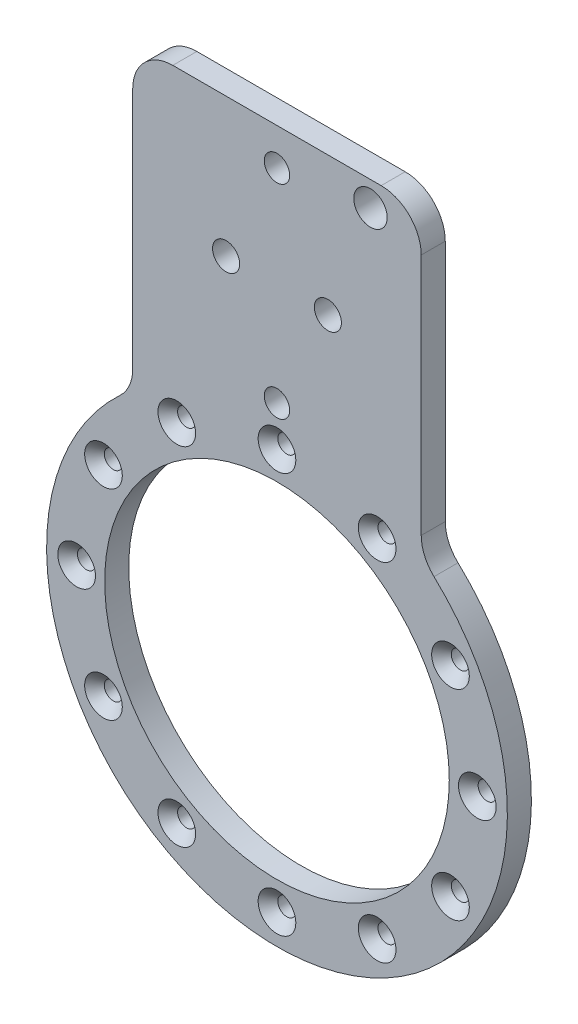
ISO-10303-21;
HEADER;
FILE_DESCRIPTION(('STEP AP214'),'2;1');
FILE_NAME('part.step','',(''),(''),'','','');
FILE_SCHEMA(('AUTOMOTIVE_DESIGN { 1 0 10303 214 1 1 1 1 }'));
ENDSEC;
DATA;
#1=APPLICATION_CONTEXT('core data for automotive mechanical design processes');
#2=APPLICATION_PROTOCOL_DEFINITION('international standard','automotive_design',2000,#1);
#3=PRODUCT_CONTEXT('',#1,'mechanical');
#4=PRODUCT('Part','Part','',(#3));
#5=PRODUCT_RELATED_PRODUCT_CATEGORY('part','',(#4));
#6=PRODUCT_DEFINITION_FORMATION('','',#4);
#7=PRODUCT_DEFINITION_CONTEXT('part definition',#1,'design');
#8=PRODUCT_DEFINITION('design','',#6,#7);
#9=PRODUCT_DEFINITION_SHAPE('','',#8);
#10=(LENGTH_UNIT() NAMED_UNIT(*) SI_UNIT(.MILLI.,.METRE.));
#11=(NAMED_UNIT(*) PLANE_ANGLE_UNIT() SI_UNIT($,.RADIAN.));
#12=(NAMED_UNIT(*) SI_UNIT($,.STERADIAN.) SOLID_ANGLE_UNIT());
#13=UNCERTAINTY_MEASURE_WITH_UNIT(LENGTH_MEASURE(1.E-05),#10,'distance_accuracy_value','');
#14=(GEOMETRIC_REPRESENTATION_CONTEXT(3) GLOBAL_UNCERTAINTY_ASSIGNED_CONTEXT((#13)) GLOBAL_UNIT_ASSIGNED_CONTEXT((#10,
#11,#12)) REPRESENTATION_CONTEXT('',''));
#15=CARTESIAN_POINT('',(0.,0.,0.));
#16=DIRECTION('',(0.,0.,1.));
#17=DIRECTION('',(1.,0.,0.));
#18=AXIS2_PLACEMENT_3D('',#15,#16,#17);
#19=CARTESIAN_POINT('',(0.,0.,3.));
#20=DIRECTION('',(0.,0.,1.));
#21=DIRECTION('',(1.,0.,0.));
#22=AXIS2_PLACEMENT_3D('',#19,#20,#21);
#23=PLANE('',#22);
#24=CARTESIAN_POINT('',(23.335,113.835,3.));
#25=DIRECTION('',(0.,0.,-1.));
#26=DIRECTION('',(-1.,0.,0.));
#27=AXIS2_PLACEMENT_3D('',#24,#25,#26);
#28=CIRCLE('',#27,4.165);
#29=CARTESIAN_POINT('',(19.17,113.835,3.));
#30=VERTEX_POINT('',#29);
#31=EDGE_CURVE('E604',#30,#30,#28,.T.);
#32=ORIENTED_EDGE('',*,*,#31,.T.);
#33=EDGE_LOOP('',(#32));
#34=FACE_BOUND('',#33,.T.);
#35=CARTESIAN_POINT('',(0.,50.,3.));
#36=DIRECTION('',(0.,0.,1.));
#37=DIRECTION('',(1.,0.,0.));
#38=AXIS2_PLACEMENT_3D('',#35,#36,#37);
#39=CIRCLE('',#38,4.7);
#40=CARTESIAN_POINT('',(4.7,50.,3.));
#41=VERTEX_POINT('',#40);
#42=EDGE_CURVE('E601',#41,#41,#39,.T.);
#43=ORIENTED_EDGE('',*,*,#42,.F.);
#44=EDGE_LOOP('',(#43));
#45=FACE_BOUND('',#44,.T.);
#46=CARTESIAN_POINT('',(25.,43.3012701892219,3.));
#47=DIRECTION('',(0.,0.,1.));
#48=DIRECTION('',(1.,0.,0.));
#49=AXIS2_PLACEMENT_3D('',#46,#47,#48);
#50=CIRCLE('',#49,4.7);
#51=CARTESIAN_POINT('',(29.7,43.3012701892219,3.));
#52=VERTEX_POINT('',#51);
#53=EDGE_CURVE('E595',#52,#52,#50,.T.);
#54=ORIENTED_EDGE('',*,*,#53,.F.);
#55=EDGE_LOOP('',(#54));
#56=FACE_BOUND('',#55,.T.);
#57=CARTESIAN_POINT('',(43.3012701892219,25.,3.));
#58=DIRECTION('',(0.,0.,1.));
#59=DIRECTION('',(1.,0.,0.));
#60=AXIS2_PLACEMENT_3D('',#57,#58,#59);
#61=CIRCLE('',#60,4.7);
#62=CARTESIAN_POINT('',(48.0012701892219,25.,3.));
#63=VERTEX_POINT('',#62);
#64=EDGE_CURVE('E589',#63,#63,#61,.T.);
#65=ORIENTED_EDGE('',*,*,#64,.F.);
#66=EDGE_LOOP('',(#65));
#67=FACE_BOUND('',#66,.T.);
#68=CARTESIAN_POINT('',(50.,0.,3.));
#69=DIRECTION('',(0.,0.,1.));
#70=DIRECTION('',(1.,0.,0.));
#71=AXIS2_PLACEMENT_3D('',#68,#69,#70);
#72=CIRCLE('',#71,4.7);
#73=CARTESIAN_POINT('',(54.7,0.,3.));
#74=VERTEX_POINT('',#73);
#75=EDGE_CURVE('E583',#74,#74,#72,.T.);
#76=ORIENTED_EDGE('',*,*,#75,.F.);
#77=EDGE_LOOP('',(#76));
#78=FACE_BOUND('',#77,.T.);
#79=CARTESIAN_POINT('',(43.3012701892219,-25.,3.));
#80=DIRECTION('',(0.,0.,1.));
#81=DIRECTION('',(1.,0.,0.));
#82=AXIS2_PLACEMENT_3D('',#79,#80,#81);
#83=CIRCLE('',#82,4.7);
#84=CARTESIAN_POINT('',(48.0012701892219,-25.,3.));
#85=VERTEX_POINT('',#84);
#86=EDGE_CURVE('E577',#85,#85,#83,.T.);
#87=ORIENTED_EDGE('',*,*,#86,.F.);
#88=EDGE_LOOP('',(#87));
#89=FACE_BOUND('',#88,.T.);
#90=CARTESIAN_POINT('',(25.,-43.3012701892219,3.));
#91=DIRECTION('',(0.,0.,1.));
#92=DIRECTION('',(1.,0.,0.));
#93=AXIS2_PLACEMENT_3D('',#90,#91,#92);
#94=CIRCLE('',#93,4.7);
#95=CARTESIAN_POINT('',(29.7,-43.3012701892219,3.));
#96=VERTEX_POINT('',#95);
#97=EDGE_CURVE('E571',#96,#96,#94,.T.);
#98=ORIENTED_EDGE('',*,*,#97,.F.);
#99=EDGE_LOOP('',(#98));
#100=FACE_BOUND('',#99,.T.);
#101=CARTESIAN_POINT('',(0.,-50.,3.));
#102=DIRECTION('',(0.,0.,1.));
#103=DIRECTION('',(1.,0.,0.));
#104=AXIS2_PLACEMENT_3D('',#101,#102,#103);
#105=CIRCLE('',#104,4.7);
#106=CARTESIAN_POINT('',(4.7,-50.,3.));
#107=VERTEX_POINT('',#106);
#108=EDGE_CURVE('E565',#107,#107,#105,.T.);
#109=ORIENTED_EDGE('',*,*,#108,.F.);
#110=EDGE_LOOP('',(#109));
#111=FACE_BOUND('',#110,.T.);
#112=CARTESIAN_POINT('',(-25.,-43.3012701892219,3.));
#113=DIRECTION('',(0.,0.,1.));
#114=DIRECTION('',(1.,0.,0.));
#115=AXIS2_PLACEMENT_3D('',#112,#113,#114);
#116=CIRCLE('',#115,4.7);
#117=CARTESIAN_POINT('',(-20.3,-43.3012701892219,3.));
#118=VERTEX_POINT('',#117);
#119=EDGE_CURVE('E559',#118,#118,#116,.T.);
#120=ORIENTED_EDGE('',*,*,#119,.F.);
#121=EDGE_LOOP('',(#120));
#122=FACE_BOUND('',#121,.T.);
#123=CARTESIAN_POINT('',(-43.3012701892219,-25.,3.));
#124=DIRECTION('',(0.,0.,1.));
#125=DIRECTION('',(1.,0.,0.));
#126=AXIS2_PLACEMENT_3D('',#123,#124,#125);
#127=CIRCLE('',#126,4.7);
#128=CARTESIAN_POINT('',(-38.6012701892219,-25.,3.));
#129=VERTEX_POINT('',#128);
#130=EDGE_CURVE('E553',#129,#129,#127,.T.);
#131=ORIENTED_EDGE('',*,*,#130,.F.);
#132=EDGE_LOOP('',(#131));
#133=FACE_BOUND('',#132,.T.);
#134=CARTESIAN_POINT('',(-50.,0.,3.));
#135=DIRECTION('',(0.,0.,1.));
#136=DIRECTION('',(1.,0.,0.));
#137=AXIS2_PLACEMENT_3D('',#134,#135,#136);
#138=CIRCLE('',#137,4.7);
#139=CARTESIAN_POINT('',(-45.3,0.,3.));
#140=VERTEX_POINT('',#139);
#141=EDGE_CURVE('E547',#140,#140,#138,.T.);
#142=ORIENTED_EDGE('',*,*,#141,.F.);
#143=EDGE_LOOP('',(#142));
#144=FACE_BOUND('',#143,.T.);
#145=CARTESIAN_POINT('',(-43.301270189222,25.,3.));
#146=DIRECTION('',(0.,0.,1.));
#147=DIRECTION('',(1.,0.,0.));
#148=AXIS2_PLACEMENT_3D('',#145,#146,#147);
#149=CIRCLE('',#148,4.7);
#150=CARTESIAN_POINT('',(-38.6012701892219,25.,3.));
#151=VERTEX_POINT('',#150);
#152=EDGE_CURVE('E541',#151,#151,#149,.T.);
#153=ORIENTED_EDGE('',*,*,#152,.F.);
#154=EDGE_LOOP('',(#153));
#155=FACE_BOUND('',#154,.T.);
#156=CARTESIAN_POINT('',(-25.,43.3012701892219,3.));
#157=DIRECTION('',(0.,0.,1.));
#158=DIRECTION('',(1.,0.,0.));
#159=AXIS2_PLACEMENT_3D('',#156,#157,#158);
#160=CIRCLE('',#159,4.7);
#161=CARTESIAN_POINT('',(-20.3,43.3012701892219,3.));
#162=VERTEX_POINT('',#161);
#163=EDGE_CURVE('E535',#162,#162,#160,.T.);
#164=ORIENTED_EDGE('',*,*,#163,.F.);
#165=EDGE_LOOP('',(#164));
#166=FACE_BOUND('',#165,.T.);
#167=CARTESIAN_POINT('',(-12.7,85.4,3.));
#168=DIRECTION('',(0.,0.,1.));
#169=DIRECTION('',(1.,0.,0.));
#170=AXIS2_PLACEMENT_3D('',#167,#168,#169);
#171=CIRCLE('',#170,3.3782);
#172=CARTESIAN_POINT('',(-9.3218,85.4,3.));
#173=VERTEX_POINT('',#172);
#174=EDGE_CURVE('E531',#173,#173,#171,.T.);
#175=ORIENTED_EDGE('',*,*,#174,.F.);
#176=EDGE_LOOP('',(#175));
#177=FACE_BOUND('',#176,.T.);
#178=CARTESIAN_POINT('',(12.7,85.4,3.));
#179=DIRECTION('',(0.,0.,1.));
#180=DIRECTION('',(1.,0.,0.));
#181=AXIS2_PLACEMENT_3D('',#178,#179,#180);
#182=CIRCLE('',#181,3.3782);
#183=CARTESIAN_POINT('',(16.0782,85.4,3.));
#184=VERTEX_POINT('',#183);
#185=EDGE_CURVE('E525',#184,#184,#182,.T.);
#186=ORIENTED_EDGE('',*,*,#185,.F.);
#187=EDGE_LOOP('',(#186));
#188=FACE_BOUND('',#187,.T.);
#189=CARTESIAN_POINT('',(0.,60.,3.));
#190=DIRECTION('',(0.,0.,1.));
#191=DIRECTION('',(1.,0.,0.));
#192=AXIS2_PLACEMENT_3D('',#189,#190,#191);
#193=CIRCLE('',#192,3.175);
#194=CARTESIAN_POINT('',(3.175,60.,3.));
#195=VERTEX_POINT('',#194);
#196=EDGE_CURVE('E519',#195,#195,#193,.T.);
#197=ORIENTED_EDGE('',*,*,#196,.F.);
#198=EDGE_LOOP('',(#197));
#199=FACE_BOUND('',#198,.T.);
#200=CARTESIAN_POINT('',(0.,110.8,3.));
#201=DIRECTION('',(0.,0.,1.));
#202=DIRECTION('',(1.,0.,0.));
#203=AXIS2_PLACEMENT_3D('',#200,#201,#202);
#204=CIRCLE('',#203,3.175);
#205=CARTESIAN_POINT('',(3.175,110.8,3.));
#206=VERTEX_POINT('',#205);
#207=EDGE_CURVE('E513',#206,#206,#204,.T.);
#208=ORIENTED_EDGE('',*,*,#207,.F.);
#209=EDGE_LOOP('',(#208));
#210=FACE_BOUND('',#209,.T.);
#211=DIRECTION('',(0.,1.,0.));
#212=VECTOR('',#211,1.);
#213=CARTESIAN_POINT('',(36.,120.,3.));
#214=LINE('',#213,#212);
#215=CARTESIAN_POINT('',(36.,49.3988866271295,3.));
#216=VERTEX_POINT('',#215);
#217=CARTESIAN_POINT('',(36.,110.,3.));
#218=VERTEX_POINT('',#217);
#219=EDGE_CURVE('E175',#216,#218,#214,.T.);
#220=ORIENTED_EDGE('',*,*,#219,.T.);
#221=CARTESIAN_POINT('',(26.,110.,3.));
#222=DIRECTION('',(0.,0.,1.));
#223=DIRECTION('',(1.,0.,0.));
#224=AXIS2_PLACEMENT_3D('',#221,#222,#223);
#225=CIRCLE('',#224,10.);
#226=CARTESIAN_POINT('',(26.,120.,3.));
#227=VERTEX_POINT('',#226);
#228=EDGE_CURVE('E146',#218,#227,#225,.T.);
#229=ORIENTED_EDGE('',*,*,#228,.T.);
#230=DIRECTION('',(-1.,0.,0.));
#231=VECTOR('',#230,1.);
#232=CARTESIAN_POINT('',(-36.,120.,3.));
#233=LINE('',#232,#231);
#234=CARTESIAN_POINT('',(-26.,120.,3.));
#235=VERTEX_POINT('',#234);
#236=EDGE_CURVE('E124',#227,#235,#233,.T.);
#237=ORIENTED_EDGE('',*,*,#236,.T.);
#238=CARTESIAN_POINT('',(-26.,110.,3.));
#239=DIRECTION('',(0.,0.,1.));
#240=DIRECTION('',(1.,0.,0.));
#241=AXIS2_PLACEMENT_3D('',#238,#239,#240);
#242=CIRCLE('',#241,10.);
#243=CARTESIAN_POINT('',(-36.,110.,3.));
#244=VERTEX_POINT('',#243);
#245=EDGE_CURVE('E61',#235,#244,#242,.T.);
#246=ORIENTED_EDGE('',*,*,#245,.T.);
#247=DIRECTION('',(0.,-1.,0.));
#248=VECTOR('',#247,1.);
#249=CARTESIAN_POINT('',(-36.,44.8358115795845,3.));
#250=LINE('',#249,#248);
#251=CARTESIAN_POINT('',(-36.,49.3988866271295,3.));
#252=VERTEX_POINT('',#251);
#253=EDGE_CURVE('E139',#244,#252,#250,.T.);
#254=ORIENTED_EDGE('',*,*,#253,.T.);
#255=CARTESIAN_POINT('',(-46.,49.3988866271295,3.));
#256=DIRECTION('',(0.,0.,1.));
#257=DIRECTION('',(1.,0.,0.));
#258=AXIS2_PLACEMENT_3D('',#255,#256,#257);
#259=CIRCLE('',#258,10.);
#260=CARTESIAN_POINT('',(-39.1851851851852,42.08053305274,3.));
#261=VERTEX_POINT('',#260);
#262=EDGE_CURVE('E159',#252,#261,#259,.F.);
#263=ORIENTED_EDGE('',*,*,#262,.T.);
#264=CARTESIAN_POINT('',(0.,0.,3.));
#265=DIRECTION('',(0.,0.,1.));
#266=DIRECTION('',(1.,0.,0.));
#267=AXIS2_PLACEMENT_3D('',#264,#265,#266);
#268=CIRCLE('',#267,57.5);
#269=CARTESIAN_POINT('',(39.1851851851852,42.08053305274,3.));
#270=VERTEX_POINT('',#269);
#271=EDGE_CURVE('E133',#261,#270,#268,.T.);
#272=ORIENTED_EDGE('',*,*,#271,.T.);
#273=CARTESIAN_POINT('',(46.,49.3988866271295,3.));
#274=DIRECTION('',(0.,0.,1.));
#275=DIRECTION('',(1.,0.,0.));
#276=AXIS2_PLACEMENT_3D('',#273,#274,#275);
#277=CIRCLE('',#276,10.);
#278=EDGE_CURVE('E11',#270,#216,#277,.F.);
#279=ORIENTED_EDGE('',*,*,#278,.T.);
#280=EDGE_LOOP('',(#220,#229,#237,#246,#254,#263,#272,#279));
#281=FACE_BOUND('',#280,.T.);
#282=CARTESIAN_POINT('',(0.,0.,3.));
#283=DIRECTION('',(0.,0.,1.));
#284=DIRECTION('',(1.,0.,0.));
#285=AXIS2_PLACEMENT_3D('',#282,#283,#284);
#286=CIRCLE('',#285,43.);
#287=CARTESIAN_POINT('',(43.,0.,3.));
#288=VERTEX_POINT('',#287);
#289=EDGE_CURVE('E170',#288,#288,#286,.T.);
#290=ORIENTED_EDGE('',*,*,#289,.F.);
#291=EDGE_LOOP('',(#290));
#292=FACE_BOUND('',#291,.T.);
#293=ADVANCED_FACE('F39',(#34,#45,#56,#67,#78,#89,#100,#111,#122,#133,#144,#155,#166,#177,#188,
#199,#210,#281,#292),#23,.T.);
#294=CARTESIAN_POINT('',(0.,0.,-3.));
#295=DIRECTION('',(0.,0.,1.));
#296=DIRECTION('',(1.,0.,0.));
#297=AXIS2_PLACEMENT_3D('',#294,#295,#296);
#298=PLANE('',#297);
#299=CARTESIAN_POINT('',(23.335,113.835,-3.));
#300=DIRECTION('',(0.,0.,-1.));
#301=DIRECTION('',(-1.,0.,0.));
#302=AXIS2_PLACEMENT_3D('',#299,#300,#301);
#303=CIRCLE('',#302,4.165);
#304=CARTESIAN_POINT('',(19.17,113.835,-3.));
#305=VERTEX_POINT('',#304);
#306=EDGE_CURVE('E605',#305,#305,#303,.T.);
#307=ORIENTED_EDGE('',*,*,#306,.F.);
#308=EDGE_LOOP('',(#307));
#309=FACE_BOUND('',#308,.T.);
#310=CARTESIAN_POINT('',(-12.7,85.4,-3.));
#311=DIRECTION('',(0.,0.,1.));
#312=DIRECTION('',(1.,0.,0.));
#313=AXIS2_PLACEMENT_3D('',#310,#311,#312);
#314=CIRCLE('',#313,3.3782);
#315=CARTESIAN_POINT('',(-9.3218,85.4,-3.));
#316=VERTEX_POINT('',#315);
#317=EDGE_CURVE('E528',#316,#316,#314,.T.);
#318=ORIENTED_EDGE('',*,*,#317,.T.);
#319=EDGE_LOOP('',(#318));
#320=FACE_BOUND('',#319,.T.);
#321=CARTESIAN_POINT('',(12.7,85.4,-3.));
#322=DIRECTION('',(0.,0.,1.));
#323=DIRECTION('',(1.,0.,0.));
#324=AXIS2_PLACEMENT_3D('',#321,#322,#323);
#325=CIRCLE('',#324,3.3782);
#326=CARTESIAN_POINT('',(16.0782,85.4,-3.));
#327=VERTEX_POINT('',#326);
#328=EDGE_CURVE('E522',#327,#327,#325,.T.);
#329=ORIENTED_EDGE('',*,*,#328,.T.);
#330=EDGE_LOOP('',(#329));
#331=FACE_BOUND('',#330,.T.);
#332=CARTESIAN_POINT('',(0.,60.,-3.));
#333=DIRECTION('',(0.,0.,1.));
#334=DIRECTION('',(1.,0.,0.));
#335=AXIS2_PLACEMENT_3D('',#332,#333,#334);
#336=CIRCLE('',#335,3.175);
#337=CARTESIAN_POINT('',(3.175,60.,-3.));
#338=VERTEX_POINT('',#337);
#339=EDGE_CURVE('E516',#338,#338,#336,.T.);
#340=ORIENTED_EDGE('',*,*,#339,.T.);
#341=EDGE_LOOP('',(#340));
#342=FACE_BOUND('',#341,.T.);
#343=CARTESIAN_POINT('',(0.,110.8,-3.));
#344=DIRECTION('',(0.,0.,1.));
#345=DIRECTION('',(1.,0.,0.));
#346=AXIS2_PLACEMENT_3D('',#343,#344,#345);
#347=CIRCLE('',#346,3.175);
#348=CARTESIAN_POINT('',(3.175,110.8,-3.));
#349=VERTEX_POINT('',#348);
#350=EDGE_CURVE('E510',#349,#349,#347,.T.);
#351=ORIENTED_EDGE('',*,*,#350,.T.);
#352=EDGE_LOOP('',(#351));
#353=FACE_BOUND('',#352,.T.);
#354=CARTESIAN_POINT('',(0.,50.,-3.));
#355=DIRECTION('',(0.,0.,1.));
#356=DIRECTION('',(1.,0.,0.));
#357=AXIS2_PLACEMENT_3D('',#354,#355,#356);
#358=CIRCLE('',#357,2.25);
#359=CARTESIAN_POINT('',(2.25,50.,-3.));
#360=VERTEX_POINT('',#359);
#361=EDGE_CURVE('E507',#360,#360,#358,.T.);
#362=ORIENTED_EDGE('',*,*,#361,.T.);
#363=EDGE_LOOP('',(#362));
#364=FACE_BOUND('',#363,.T.);
#365=CARTESIAN_POINT('',(25.,43.3012701892219,-3.));
#366=DIRECTION('',(0.,0.,1.));
#367=DIRECTION('',(1.,0.,0.));
#368=AXIS2_PLACEMENT_3D('',#365,#366,#367);
#369=CIRCLE('',#368,2.25);
#370=CARTESIAN_POINT('',(27.25,43.3012701892219,-3.));
#371=VERTEX_POINT('',#370);
#372=EDGE_CURVE('E504',#371,#371,#369,.T.);
#373=ORIENTED_EDGE('',*,*,#372,.T.);
#374=EDGE_LOOP('',(#373));
#375=FACE_BOUND('',#374,.T.);
#376=CARTESIAN_POINT('',(43.3012701892219,25.,-3.));
#377=DIRECTION('',(0.,0.,1.));
#378=DIRECTION('',(1.,0.,0.));
#379=AXIS2_PLACEMENT_3D('',#376,#377,#378);
#380=CIRCLE('',#379,2.25);
#381=CARTESIAN_POINT('',(45.5512701892219,25.,-3.));
#382=VERTEX_POINT('',#381);
#383=EDGE_CURVE('E501',#382,#382,#380,.T.);
#384=ORIENTED_EDGE('',*,*,#383,.T.);
#385=EDGE_LOOP('',(#384));
#386=FACE_BOUND('',#385,.T.);
#387=CARTESIAN_POINT('',(50.,0.,-3.));
#388=DIRECTION('',(0.,0.,1.));
#389=DIRECTION('',(1.,0.,0.));
#390=AXIS2_PLACEMENT_3D('',#387,#388,#389);
#391=CIRCLE('',#390,2.25);
#392=CARTESIAN_POINT('',(52.25,0.,-3.));
#393=VERTEX_POINT('',#392);
#394=EDGE_CURVE('E498',#393,#393,#391,.T.);
#395=ORIENTED_EDGE('',*,*,#394,.T.);
#396=EDGE_LOOP('',(#395));
#397=FACE_BOUND('',#396,.T.);
#398=CARTESIAN_POINT('',(43.3012701892219,-25.,-3.));
#399=DIRECTION('',(0.,0.,1.));
#400=DIRECTION('',(1.,0.,0.));
#401=AXIS2_PLACEMENT_3D('',#398,#399,#400);
#402=CIRCLE('',#401,2.25);
#403=CARTESIAN_POINT('',(45.5512701892219,-25.,-3.));
#404=VERTEX_POINT('',#403);
#405=EDGE_CURVE('E495',#404,#404,#402,.T.);
#406=ORIENTED_EDGE('',*,*,#405,.T.);
#407=EDGE_LOOP('',(#406));
#408=FACE_BOUND('',#407,.T.);
#409=CARTESIAN_POINT('',(25.,-43.3012701892219,-3.));
#410=DIRECTION('',(0.,0.,1.));
#411=DIRECTION('',(1.,0.,0.));
#412=AXIS2_PLACEMENT_3D('',#409,#410,#411);
#413=CIRCLE('',#412,2.25);
#414=CARTESIAN_POINT('',(27.25,-43.3012701892219,-3.));
#415=VERTEX_POINT('',#414);
#416=EDGE_CURVE('E492',#415,#415,#413,.T.);
#417=ORIENTED_EDGE('',*,*,#416,.T.);
#418=EDGE_LOOP('',(#417));
#419=FACE_BOUND('',#418,.T.);
#420=CARTESIAN_POINT('',(0.,-50.,-3.));
#421=DIRECTION('',(0.,0.,1.));
#422=DIRECTION('',(1.,0.,0.));
#423=AXIS2_PLACEMENT_3D('',#420,#421,#422);
#424=CIRCLE('',#423,2.25);
#425=CARTESIAN_POINT('',(2.25,-50.,-3.));
#426=VERTEX_POINT('',#425);
#427=EDGE_CURVE('E489',#426,#426,#424,.T.);
#428=ORIENTED_EDGE('',*,*,#427,.T.);
#429=EDGE_LOOP('',(#428));
#430=FACE_BOUND('',#429,.T.);
#431=CARTESIAN_POINT('',(-25.,-43.3012701892219,-3.));
#432=DIRECTION('',(0.,0.,1.));
#433=DIRECTION('',(1.,0.,0.));
#434=AXIS2_PLACEMENT_3D('',#431,#432,#433);
#435=CIRCLE('',#434,2.25);
#436=CARTESIAN_POINT('',(-22.75,-43.3012701892219,-3.));
#437=VERTEX_POINT('',#436);
#438=EDGE_CURVE('E486',#437,#437,#435,.T.);
#439=ORIENTED_EDGE('',*,*,#438,.T.);
#440=EDGE_LOOP('',(#439));
#441=FACE_BOUND('',#440,.T.);
#442=CARTESIAN_POINT('',(-43.3012701892219,-25.,-3.));
#443=DIRECTION('',(0.,0.,1.));
#444=DIRECTION('',(1.,0.,0.));
#445=AXIS2_PLACEMENT_3D('',#442,#443,#444);
#446=CIRCLE('',#445,2.25);
#447=CARTESIAN_POINT('',(-41.0512701892219,-25.,-3.));
#448=VERTEX_POINT('',#447);
#449=EDGE_CURVE('E483',#448,#448,#446,.T.);
#450=ORIENTED_EDGE('',*,*,#449,.T.);
#451=EDGE_LOOP('',(#450));
#452=FACE_BOUND('',#451,.T.);
#453=CARTESIAN_POINT('',(-50.,0.,-3.));
#454=DIRECTION('',(0.,0.,1.));
#455=DIRECTION('',(1.,0.,0.));
#456=AXIS2_PLACEMENT_3D('',#453,#454,#455);
#457=CIRCLE('',#456,2.25);
#458=CARTESIAN_POINT('',(-47.75,0.,-3.));
#459=VERTEX_POINT('',#458);
#460=EDGE_CURVE('E473',#459,#459,#457,.T.);
#461=ORIENTED_EDGE('',*,*,#460,.T.);
#462=EDGE_LOOP('',(#461));
#463=FACE_BOUND('',#462,.T.);
#464=CARTESIAN_POINT('',(-43.301270189222,25.,-3.));
#465=DIRECTION('',(0.,0.,1.));
#466=DIRECTION('',(1.,0.,0.));
#467=AXIS2_PLACEMENT_3D('',#464,#465,#466);
#468=CIRCLE('',#467,2.25);
#469=CARTESIAN_POINT('',(-41.051270189222,25.,-3.));
#470=VERTEX_POINT('',#469);
#471=EDGE_CURVE('E469',#470,#470,#468,.T.);
#472=ORIENTED_EDGE('',*,*,#471,.T.);
#473=EDGE_LOOP('',(#472));
#474=FACE_BOUND('',#473,.T.);
#475=CARTESIAN_POINT('',(-25.,43.3012701892219,-3.));
#476=DIRECTION('',(0.,0.,1.));
#477=DIRECTION('',(1.,0.,0.));
#478=AXIS2_PLACEMENT_3D('',#475,#476,#477);
#479=CIRCLE('',#478,2.25);
#480=CARTESIAN_POINT('',(-22.75,43.3012701892219,-3.));
#481=VERTEX_POINT('',#480);
#482=EDGE_CURVE('E466',#481,#481,#479,.T.);
#483=ORIENTED_EDGE('',*,*,#482,.T.);
#484=EDGE_LOOP('',(#483));
#485=FACE_BOUND('',#484,.T.);
#486=DIRECTION('',(-1.,0.,0.));
#487=VECTOR('',#486,1.);
#488=CARTESIAN_POINT('',(-36.,120.,-3.));
#489=LINE('',#488,#487);
#490=CARTESIAN_POINT('',(26.,120.,-3.));
#491=VERTEX_POINT('',#490);
#492=CARTESIAN_POINT('',(-26.,120.,-3.));
#493=VERTEX_POINT('',#492);
#494=EDGE_CURVE('E122',#491,#493,#489,.T.);
#495=ORIENTED_EDGE('',*,*,#494,.F.);
#496=CARTESIAN_POINT('',(26.,110.,-3.));
#497=DIRECTION('',(0.,0.,1.));
#498=DIRECTION('',(1.,0.,0.));
#499=AXIS2_PLACEMENT_3D('',#496,#497,#498);
#500=CIRCLE('',#499,10.);
#501=CARTESIAN_POINT('',(36.,110.,-3.));
#502=VERTEX_POINT('',#501);
#503=EDGE_CURVE('E105',#491,#502,#500,.F.);
#504=ORIENTED_EDGE('',*,*,#503,.T.);
#505=DIRECTION('',(0.,1.,0.));
#506=VECTOR('',#505,1.);
#507=CARTESIAN_POINT('',(36.,120.,-3.));
#508=LINE('',#507,#506);
#509=CARTESIAN_POINT('',(36.,49.3988866271295,-3.));
#510=VERTEX_POINT('',#509);
#511=EDGE_CURVE('E131',#510,#502,#508,.T.);
#512=ORIENTED_EDGE('',*,*,#511,.F.);
#513=CARTESIAN_POINT('',(46.,49.3988866271295,-3.));
#514=DIRECTION('',(0.,0.,1.));
#515=DIRECTION('',(1.,0.,0.));
#516=AXIS2_PLACEMENT_3D('',#513,#514,#515);
#517=CIRCLE('',#516,10.);
#518=CARTESIAN_POINT('',(39.1851851851852,42.08053305274,-3.));
#519=VERTEX_POINT('',#518);
#520=EDGE_CURVE('E47',#510,#519,#517,.T.);
#521=ORIENTED_EDGE('',*,*,#520,.T.);
#522=CARTESIAN_POINT('',(0.,0.,-3.));
#523=DIRECTION('',(0.,0.,1.));
#524=DIRECTION('',(1.,0.,0.));
#525=AXIS2_PLACEMENT_3D('',#522,#523,#524);
#526=CIRCLE('',#525,57.5);
#527=CARTESIAN_POINT('',(-39.1851851851852,42.08053305274,-3.));
#528=VERTEX_POINT('',#527);
#529=EDGE_CURVE('E135',#528,#519,#526,.T.);
#530=ORIENTED_EDGE('',*,*,#529,.F.);
#531=CARTESIAN_POINT('',(-46.,49.3988866271295,-3.));
#532=DIRECTION('',(0.,0.,1.));
#533=DIRECTION('',(1.,0.,0.));
#534=AXIS2_PLACEMENT_3D('',#531,#532,#533);
#535=CIRCLE('',#534,10.);
#536=CARTESIAN_POINT('',(-36.,49.3988866271295,-3.));
#537=VERTEX_POINT('',#536);
#538=EDGE_CURVE('E157',#528,#537,#535,.T.);
#539=ORIENTED_EDGE('',*,*,#538,.T.);
#540=DIRECTION('',(0.,-1.,0.));
#541=VECTOR('',#540,1.);
#542=CARTESIAN_POINT('',(-36.,44.8358115795845,-3.));
#543=LINE('',#542,#541);
#544=CARTESIAN_POINT('',(-36.,110.,-3.));
#545=VERTEX_POINT('',#544);
#546=EDGE_CURVE('E130',#545,#537,#543,.T.);
#547=ORIENTED_EDGE('',*,*,#546,.F.);
#548=CARTESIAN_POINT('',(-26.,110.,-3.));
#549=DIRECTION('',(0.,0.,1.));
#550=DIRECTION('',(1.,0.,0.));
#551=AXIS2_PLACEMENT_3D('',#548,#549,#550);
#552=CIRCLE('',#551,10.);
#553=EDGE_CURVE('E116',#545,#493,#552,.F.);
#554=ORIENTED_EDGE('',*,*,#553,.T.);
#555=EDGE_LOOP('',(#495,#504,#512,#521,#530,#539,#547,#554));
#556=FACE_BOUND('',#555,.T.);
#557=CARTESIAN_POINT('',(0.,0.,-3.));
#558=DIRECTION('',(0.,0.,1.));
#559=DIRECTION('',(1.,0.,0.));
#560=AXIS2_PLACEMENT_3D('',#557,#558,#559);
#561=CIRCLE('',#560,43.);
#562=CARTESIAN_POINT('',(43.,0.,-3.));
#563=VERTEX_POINT('',#562);
#564=EDGE_CURVE('E468',#563,#563,#561,.T.);
#565=ORIENTED_EDGE('',*,*,#564,.T.);
#566=EDGE_LOOP('',(#565));
#567=FACE_BOUND('',#566,.T.);
#568=ADVANCED_FACE('F127',(#309,#320,#331,#342,#353,#364,#375,#386,#397,#408,#419,#430,#441,
#452,#463,#474,#485,#556,#567),#298,.F.);
#569=CARTESIAN_POINT('',(0.,0.,3.));
#570=DIRECTION('',(0.,0.,-1.));
#571=DIRECTION('',(-1.,0.,0.));
#572=AXIS2_PLACEMENT_3D('',#569,#570,#571);
#573=CYLINDRICAL_SURFACE('',#572,57.5);
#574=ORIENTED_EDGE('',*,*,#271,.F.);
#575=DIRECTION('',(0.,0.,-1.));
#576=VECTOR('',#575,1.);
#577=CARTESIAN_POINT('',(-39.1851851851852,42.08053305274,3.));
#578=LINE('',#577,#576);
#579=EDGE_CURVE('E154',#261,#528,#578,.T.);
#580=ORIENTED_EDGE('',*,*,#579,.T.);
#581=ORIENTED_EDGE('',*,*,#529,.T.);
#582=DIRECTION('',(0.,0.,-1.));
#583=VECTOR('',#582,1.);
#584=CARTESIAN_POINT('',(39.1851851851852,42.08053305274,3.));
#585=LINE('',#584,#583);
#586=EDGE_CURVE('E152',#519,#270,#585,.F.);
#587=ORIENTED_EDGE('',*,*,#586,.T.);
#588=EDGE_LOOP('',(#574,#580,#581,#587));
#589=FACE_BOUND('',#588,.T.);
#590=ADVANCED_FACE('F167',(#589),#573,.T.);
#591=CARTESIAN_POINT('',(36.,120.,3.));
#592=DIRECTION('',(-1.,0.,0.));
#593=DIRECTION('',(0.,-1.,0.));
#594=AXIS2_PLACEMENT_3D('',#591,#592,#593);
#595=PLANE('',#594);
#596=ORIENTED_EDGE('',*,*,#511,.T.);
#597=DIRECTION('',(0.,0.,-1.));
#598=VECTOR('',#597,1.);
#599=CARTESIAN_POINT('',(36.,110.,3.));
#600=LINE('',#599,#598);
#601=EDGE_CURVE('E110',#502,#218,#600,.F.);
#602=ORIENTED_EDGE('',*,*,#601,.T.);
#603=ORIENTED_EDGE('',*,*,#219,.F.);
#604=DIRECTION('',(0.,0.,1.));
#605=VECTOR('',#604,1.);
#606=CARTESIAN_POINT('',(36.,49.3988866271295,-3.));
#607=LINE('',#606,#605);
#608=EDGE_CURVE('E115',#216,#510,#607,.F.);
#609=ORIENTED_EDGE('',*,*,#608,.T.);
#610=EDGE_LOOP('',(#596,#602,#603,#609));
#611=FACE_BOUND('',#610,.T.);
#612=ADVANCED_FACE('F177',(#611),#595,.F.);
#613=CARTESIAN_POINT('',(-36.,120.,3.));
#614=DIRECTION('',(0.,-1.,0.));
#615=DIRECTION('',(0.,0.,-1.));
#616=AXIS2_PLACEMENT_3D('',#613,#614,#615);
#617=PLANE('',#616);
#618=ORIENTED_EDGE('',*,*,#236,.F.);
#619=DIRECTION('',(0.,0.,-1.));
#620=VECTOR('',#619,1.);
#621=CARTESIAN_POINT('',(26.,120.,3.));
#622=LINE('',#621,#620);
#623=EDGE_CURVE('E109',#227,#491,#622,.T.);
#624=ORIENTED_EDGE('',*,*,#623,.T.);
#625=ORIENTED_EDGE('',*,*,#494,.T.);
#626=DIRECTION('',(0.,0.,-1.));
#627=VECTOR('',#626,1.);
#628=CARTESIAN_POINT('',(-26.,120.,3.));
#629=LINE('',#628,#627);
#630=EDGE_CURVE('E125',#493,#235,#629,.F.);
#631=ORIENTED_EDGE('',*,*,#630,.T.);
#632=EDGE_LOOP('',(#618,#624,#625,#631));
#633=FACE_BOUND('',#632,.T.);
#634=ADVANCED_FACE('F121',(#633),#617,.F.);
#635=CARTESIAN_POINT('',(-36.,44.8358115795845,3.));
#636=DIRECTION('',(1.,0.,0.));
#637=DIRECTION('',(0.,1.,0.));
#638=AXIS2_PLACEMENT_3D('',#635,#636,#637);
#639=PLANE('',#638);
#640=ORIENTED_EDGE('',*,*,#253,.F.);
#641=DIRECTION('',(0.,0.,-1.));
#642=VECTOR('',#641,1.);
#643=CARTESIAN_POINT('',(-36.,110.,3.));
#644=LINE('',#643,#642);
#645=EDGE_CURVE('E149',#244,#545,#644,.T.);
#646=ORIENTED_EDGE('',*,*,#645,.T.);
#647=ORIENTED_EDGE('',*,*,#546,.T.);
#648=DIRECTION('',(0.,0.,1.));
#649=VECTOR('',#648,1.);
#650=CARTESIAN_POINT('',(-36.,49.3988866271295,3.));
#651=LINE('',#650,#649);
#652=EDGE_CURVE('E54',#537,#252,#651,.T.);
#653=ORIENTED_EDGE('',*,*,#652,.T.);
#654=EDGE_LOOP('',(#640,#646,#647,#653));
#655=FACE_BOUND('',#654,.T.);
#656=ADVANCED_FACE('F187',(#655),#639,.F.);
#657=CARTESIAN_POINT('',(0.,0.,3.));
#658=DIRECTION('',(0.,0.,-1.));
#659=DIRECTION('',(-1.,0.,0.));
#660=AXIS2_PLACEMENT_3D('',#657,#658,#659);
#661=CYLINDRICAL_SURFACE('',#660,43.);
#662=ORIENTED_EDGE('',*,*,#289,.T.);
#663=EDGE_LOOP('',(#662));
#664=FACE_BOUND('',#663,.T.);
#665=ORIENTED_EDGE('',*,*,#564,.F.);
#666=EDGE_LOOP('',(#665));
#667=FACE_BOUND('',#666,.T.);
#668=ADVANCED_FACE('F210',(#664,#667),#661,.F.);
#669=CARTESIAN_POINT('',(-25.,43.3012701892219,3.));
#670=DIRECTION('',(0.,0.,1.));
#671=DIRECTION('',(1.,0.,0.));
#672=AXIS2_PLACEMENT_3D('',#669,#670,#671);
#673=CYLINDRICAL_SURFACE('',#672,2.24999999999999);
#674=CARTESIAN_POINT('',(-25.,43.3012701892219,0.55));
#675=DIRECTION('',(0.,0.,1.));
#676=DIRECTION('',(1.,0.,0.));
#677=AXIS2_PLACEMENT_3D('',#674,#675,#676);
#678=CIRCLE('',#677,2.25);
#679=CARTESIAN_POINT('',(-22.75,43.3012701892219,0.55));
#680=VERTEX_POINT('',#679);
#681=EDGE_CURVE('E463',#680,#680,#678,.T.);
#682=ORIENTED_EDGE('',*,*,#681,.T.);
#683=EDGE_LOOP('',(#682));
#684=FACE_BOUND('',#683,.T.);
#685=ORIENTED_EDGE('',*,*,#482,.F.);
#686=EDGE_LOOP('',(#685));
#687=FACE_BOUND('',#686,.T.);
#688=ADVANCED_FACE('F453',(#684,#687),#673,.F.);
#689=CARTESIAN_POINT('',(-43.301270189222,25.,3.));
#690=DIRECTION('',(0.,0.,1.));
#691=DIRECTION('',(1.,0.,0.));
#692=AXIS2_PLACEMENT_3D('',#689,#690,#691);
#693=CYLINDRICAL_SURFACE('',#692,2.25);
#694=CARTESIAN_POINT('',(-43.301270189222,25.,0.55));
#695=DIRECTION('',(0.,0.,1.));
#696=DIRECTION('',(1.,0.,0.));
#697=AXIS2_PLACEMENT_3D('',#694,#695,#696);
#698=CIRCLE('',#697,2.25);
#699=CARTESIAN_POINT('',(-41.051270189222,25.,0.55));
#700=VERTEX_POINT('',#699);
#701=EDGE_CURVE('E538',#700,#700,#698,.T.);
#702=ORIENTED_EDGE('',*,*,#701,.T.);
#703=EDGE_LOOP('',(#702));
#704=FACE_BOUND('',#703,.T.);
#705=ORIENTED_EDGE('',*,*,#471,.F.);
#706=EDGE_LOOP('',(#705));
#707=FACE_BOUND('',#706,.T.);
#708=ADVANCED_FACE('F450',(#704,#707),#693,.F.);
#709=CARTESIAN_POINT('',(-50.,0.,3.));
#710=DIRECTION('',(0.,0.,1.));
#711=DIRECTION('',(1.,0.,0.));
#712=AXIS2_PLACEMENT_3D('',#709,#710,#711);
#713=CYLINDRICAL_SURFACE('',#712,2.25);
#714=CARTESIAN_POINT('',(-50.,0.,0.55));
#715=DIRECTION('',(0.,0.,1.));
#716=DIRECTION('',(1.,0.,0.));
#717=AXIS2_PLACEMENT_3D('',#714,#715,#716);
#718=CIRCLE('',#717,2.25);
#719=CARTESIAN_POINT('',(-47.75,0.,0.55));
#720=VERTEX_POINT('',#719);
#721=EDGE_CURVE('E544',#720,#720,#718,.T.);
#722=ORIENTED_EDGE('',*,*,#721,.T.);
#723=EDGE_LOOP('',(#722));
#724=FACE_BOUND('',#723,.T.);
#725=ORIENTED_EDGE('',*,*,#460,.F.);
#726=EDGE_LOOP('',(#725));
#727=FACE_BOUND('',#726,.T.);
#728=ADVANCED_FACE('F446',(#724,#727),#713,.F.);
#729=CARTESIAN_POINT('',(-43.3012701892219,-25.,3.));
#730=DIRECTION('',(0.,0.,1.));
#731=DIRECTION('',(1.,0.,0.));
#732=AXIS2_PLACEMENT_3D('',#729,#730,#731);
#733=CYLINDRICAL_SURFACE('',#732,2.25);
#734=CARTESIAN_POINT('',(-43.3012701892219,-25.,0.55));
#735=DIRECTION('',(0.,0.,1.));
#736=DIRECTION('',(1.,0.,0.));
#737=AXIS2_PLACEMENT_3D('',#734,#735,#736);
#738=CIRCLE('',#737,2.25);
#739=CARTESIAN_POINT('',(-41.0512701892219,-25.,0.55));
#740=VERTEX_POINT('',#739);
#741=EDGE_CURVE('E550',#740,#740,#738,.T.);
#742=ORIENTED_EDGE('',*,*,#741,.T.);
#743=EDGE_LOOP('',(#742));
#744=FACE_BOUND('',#743,.T.);
#745=ORIENTED_EDGE('',*,*,#449,.F.);
#746=EDGE_LOOP('',(#745));
#747=FACE_BOUND('',#746,.T.);
#748=ADVANCED_FACE('F442',(#744,#747),#733,.F.);
#749=CARTESIAN_POINT('',(-25.,-43.3012701892219,3.));
#750=DIRECTION('',(0.,0.,1.));
#751=DIRECTION('',(1.,0.,0.));
#752=AXIS2_PLACEMENT_3D('',#749,#750,#751);
#753=CYLINDRICAL_SURFACE('',#752,2.24999999999999);
#754=CARTESIAN_POINT('',(-25.,-43.3012701892219,0.55));
#755=DIRECTION('',(0.,0.,1.));
#756=DIRECTION('',(1.,0.,0.));
#757=AXIS2_PLACEMENT_3D('',#754,#755,#756);
#758=CIRCLE('',#757,2.25);
#759=CARTESIAN_POINT('',(-22.75,-43.3012701892219,0.55));
#760=VERTEX_POINT('',#759);
#761=EDGE_CURVE('E556',#760,#760,#758,.T.);
#762=ORIENTED_EDGE('',*,*,#761,.T.);
#763=EDGE_LOOP('',(#762));
#764=FACE_BOUND('',#763,.T.);
#765=ORIENTED_EDGE('',*,*,#438,.F.);
#766=EDGE_LOOP('',(#765));
#767=FACE_BOUND('',#766,.T.);
#768=ADVANCED_FACE('F438',(#764,#767),#753,.F.);
#769=CARTESIAN_POINT('',(0.,-50.,3.));
#770=DIRECTION('',(0.,0.,1.));
#771=DIRECTION('',(1.,0.,0.));
#772=AXIS2_PLACEMENT_3D('',#769,#770,#771);
#773=CYLINDRICAL_SURFACE('',#772,2.24999999999999);
#774=CARTESIAN_POINT('',(0.,-50.,0.55));
#775=DIRECTION('',(0.,0.,1.));
#776=DIRECTION('',(1.,0.,0.));
#777=AXIS2_PLACEMENT_3D('',#774,#775,#776);
#778=CIRCLE('',#777,2.25);
#779=CARTESIAN_POINT('',(2.25,-50.,0.55));
#780=VERTEX_POINT('',#779);
#781=EDGE_CURVE('E562',#780,#780,#778,.T.);
#782=ORIENTED_EDGE('',*,*,#781,.T.);
#783=EDGE_LOOP('',(#782));
#784=FACE_BOUND('',#783,.T.);
#785=ORIENTED_EDGE('',*,*,#427,.F.);
#786=EDGE_LOOP('',(#785));
#787=FACE_BOUND('',#786,.T.);
#788=ADVANCED_FACE('F434',(#784,#787),#773,.F.);
#789=CARTESIAN_POINT('',(25.,-43.3012701892219,3.));
#790=DIRECTION('',(0.,0.,1.));
#791=DIRECTION('',(1.,0.,0.));
#792=AXIS2_PLACEMENT_3D('',#789,#790,#791);
#793=CYLINDRICAL_SURFACE('',#792,2.24999999999999);
#794=CARTESIAN_POINT('',(25.,-43.3012701892219,0.55));
#795=DIRECTION('',(0.,0.,1.));
#796=DIRECTION('',(1.,0.,0.));
#797=AXIS2_PLACEMENT_3D('',#794,#795,#796);
#798=CIRCLE('',#797,2.25);
#799=CARTESIAN_POINT('',(27.25,-43.3012701892219,0.55));
#800=VERTEX_POINT('',#799);
#801=EDGE_CURVE('E568',#800,#800,#798,.T.);
#802=ORIENTED_EDGE('',*,*,#801,.T.);
#803=EDGE_LOOP('',(#802));
#804=FACE_BOUND('',#803,.T.);
#805=ORIENTED_EDGE('',*,*,#416,.F.);
#806=EDGE_LOOP('',(#805));
#807=FACE_BOUND('',#806,.T.);
#808=ADVANCED_FACE('F430',(#804,#807),#793,.F.);
#809=CARTESIAN_POINT('',(43.3012701892219,-25.,3.));
#810=DIRECTION('',(0.,0.,1.));
#811=DIRECTION('',(1.,0.,0.));
#812=AXIS2_PLACEMENT_3D('',#809,#810,#811);
#813=CYLINDRICAL_SURFACE('',#812,2.25);
#814=CARTESIAN_POINT('',(43.3012701892219,-25.,0.55));
#815=DIRECTION('',(0.,0.,1.));
#816=DIRECTION('',(1.,0.,0.));
#817=AXIS2_PLACEMENT_3D('',#814,#815,#816);
#818=CIRCLE('',#817,2.25);
#819=CARTESIAN_POINT('',(45.5512701892219,-25.,0.55));
#820=VERTEX_POINT('',#819);
#821=EDGE_CURVE('E574',#820,#820,#818,.T.);
#822=ORIENTED_EDGE('',*,*,#821,.T.);
#823=EDGE_LOOP('',(#822));
#824=FACE_BOUND('',#823,.T.);
#825=ORIENTED_EDGE('',*,*,#405,.F.);
#826=EDGE_LOOP('',(#825));
#827=FACE_BOUND('',#826,.T.);
#828=ADVANCED_FACE('F426',(#824,#827),#813,.F.);
#829=CARTESIAN_POINT('',(50.,0.,3.));
#830=DIRECTION('',(0.,0.,1.));
#831=DIRECTION('',(1.,0.,0.));
#832=AXIS2_PLACEMENT_3D('',#829,#830,#831);
#833=CYLINDRICAL_SURFACE('',#832,2.25);
#834=CARTESIAN_POINT('',(50.,0.,0.55));
#835=DIRECTION('',(0.,0.,1.));
#836=DIRECTION('',(1.,0.,0.));
#837=AXIS2_PLACEMENT_3D('',#834,#835,#836);
#838=CIRCLE('',#837,2.25);
#839=CARTESIAN_POINT('',(52.25,0.,0.55));
#840=VERTEX_POINT('',#839);
#841=EDGE_CURVE('E580',#840,#840,#838,.T.);
#842=ORIENTED_EDGE('',*,*,#841,.T.);
#843=EDGE_LOOP('',(#842));
#844=FACE_BOUND('',#843,.T.);
#845=ORIENTED_EDGE('',*,*,#394,.F.);
#846=EDGE_LOOP('',(#845));
#847=FACE_BOUND('',#846,.T.);
#848=ADVANCED_FACE('F422',(#844,#847),#833,.F.);
#849=CARTESIAN_POINT('',(43.3012701892219,25.,3.));
#850=DIRECTION('',(0.,0.,1.));
#851=DIRECTION('',(1.,0.,0.));
#852=AXIS2_PLACEMENT_3D('',#849,#850,#851);
#853=CYLINDRICAL_SURFACE('',#852,2.25);
#854=CARTESIAN_POINT('',(43.3012701892219,25.,0.55));
#855=DIRECTION('',(0.,0.,1.));
#856=DIRECTION('',(1.,0.,0.));
#857=AXIS2_PLACEMENT_3D('',#854,#855,#856);
#858=CIRCLE('',#857,2.25);
#859=CARTESIAN_POINT('',(45.5512701892219,25.,0.55));
#860=VERTEX_POINT('',#859);
#861=EDGE_CURVE('E586',#860,#860,#858,.T.);
#862=ORIENTED_EDGE('',*,*,#861,.T.);
#863=EDGE_LOOP('',(#862));
#864=FACE_BOUND('',#863,.T.);
#865=ORIENTED_EDGE('',*,*,#383,.F.);
#866=EDGE_LOOP('',(#865));
#867=FACE_BOUND('',#866,.T.);
#868=ADVANCED_FACE('F418',(#864,#867),#853,.F.);
#869=CARTESIAN_POINT('',(25.,43.3012701892219,3.));
#870=DIRECTION('',(0.,0.,1.));
#871=DIRECTION('',(1.,0.,0.));
#872=AXIS2_PLACEMENT_3D('',#869,#870,#871);
#873=CYLINDRICAL_SURFACE('',#872,2.24999999999999);
#874=CARTESIAN_POINT('',(25.,43.3012701892219,0.55));
#875=DIRECTION('',(0.,0.,1.));
#876=DIRECTION('',(1.,0.,0.));
#877=AXIS2_PLACEMENT_3D('',#874,#875,#876);
#878=CIRCLE('',#877,2.25);
#879=CARTESIAN_POINT('',(27.25,43.3012701892219,0.55));
#880=VERTEX_POINT('',#879);
#881=EDGE_CURVE('E592',#880,#880,#878,.T.);
#882=ORIENTED_EDGE('',*,*,#881,.T.);
#883=EDGE_LOOP('',(#882));
#884=FACE_BOUND('',#883,.T.);
#885=ORIENTED_EDGE('',*,*,#372,.F.);
#886=EDGE_LOOP('',(#885));
#887=FACE_BOUND('',#886,.T.);
#888=ADVANCED_FACE('F414',(#884,#887),#873,.F.);
#889=CARTESIAN_POINT('',(0.,50.,3.));
#890=DIRECTION('',(0.,0.,1.));
#891=DIRECTION('',(1.,0.,0.));
#892=AXIS2_PLACEMENT_3D('',#889,#890,#891);
#893=CYLINDRICAL_SURFACE('',#892,2.24999999999999);
#894=CARTESIAN_POINT('',(0.,50.,0.55));
#895=DIRECTION('',(0.,0.,1.));
#896=DIRECTION('',(1.,0.,0.));
#897=AXIS2_PLACEMENT_3D('',#894,#895,#896);
#898=CIRCLE('',#897,2.25);
#899=CARTESIAN_POINT('',(2.25,50.,0.55));
#900=VERTEX_POINT('',#899);
#901=EDGE_CURVE('E598',#900,#900,#898,.T.);
#902=ORIENTED_EDGE('',*,*,#901,.T.);
#903=EDGE_LOOP('',(#902));
#904=FACE_BOUND('',#903,.T.);
#905=ORIENTED_EDGE('',*,*,#361,.F.);
#906=EDGE_LOOP('',(#905));
#907=FACE_BOUND('',#906,.T.);
#908=ADVANCED_FACE('F411',(#904,#907),#893,.F.);
#909=CARTESIAN_POINT('',(0.,110.8,3.));
#910=DIRECTION('',(0.,0.,1.));
#911=DIRECTION('',(1.,0.,0.));
#912=AXIS2_PLACEMENT_3D('',#909,#910,#911);
#913=CYLINDRICAL_SURFACE('',#912,3.175);
#914=ORIENTED_EDGE('',*,*,#350,.F.);
#915=EDGE_LOOP('',(#914));
#916=FACE_BOUND('',#915,.T.);
#917=ORIENTED_EDGE('',*,*,#207,.T.);
#918=EDGE_LOOP('',(#917));
#919=FACE_BOUND('',#918,.T.);
#920=ADVANCED_FACE('F407',(#916,#919),#913,.F.);
#921=CARTESIAN_POINT('',(0.,60.,3.));
#922=DIRECTION('',(0.,0.,1.));
#923=DIRECTION('',(1.,0.,0.));
#924=AXIS2_PLACEMENT_3D('',#921,#922,#923);
#925=CYLINDRICAL_SURFACE('',#924,3.175);
#926=ORIENTED_EDGE('',*,*,#339,.F.);
#927=EDGE_LOOP('',(#926));
#928=FACE_BOUND('',#927,.T.);
#929=ORIENTED_EDGE('',*,*,#196,.T.);
#930=EDGE_LOOP('',(#929));
#931=FACE_BOUND('',#930,.T.);
#932=ADVANCED_FACE('F403',(#928,#931),#925,.F.);
#933=CARTESIAN_POINT('',(12.7,85.4,3.));
#934=DIRECTION('',(0.,0.,1.));
#935=DIRECTION('',(1.,0.,0.));
#936=AXIS2_PLACEMENT_3D('',#933,#934,#935);
#937=CYLINDRICAL_SURFACE('',#936,3.3782);
#938=ORIENTED_EDGE('',*,*,#328,.F.);
#939=EDGE_LOOP('',(#938));
#940=FACE_BOUND('',#939,.T.);
#941=ORIENTED_EDGE('',*,*,#185,.T.);
#942=EDGE_LOOP('',(#941));
#943=FACE_BOUND('',#942,.T.);
#944=ADVANCED_FACE('F400',(#940,#943),#937,.F.);
#945=CARTESIAN_POINT('',(-12.7,85.4,3.));
#946=DIRECTION('',(0.,0.,1.));
#947=DIRECTION('',(1.,0.,0.));
#948=AXIS2_PLACEMENT_3D('',#945,#946,#947);
#949=CYLINDRICAL_SURFACE('',#948,3.3782);
#950=ORIENTED_EDGE('',*,*,#317,.F.);
#951=EDGE_LOOP('',(#950));
#952=FACE_BOUND('',#951,.T.);
#953=ORIENTED_EDGE('',*,*,#174,.T.);
#954=EDGE_LOOP('',(#953));
#955=FACE_BOUND('',#954,.T.);
#956=ADVANCED_FACE('F196',(#952,#955),#949,.F.);
#957=CARTESIAN_POINT('',(26.,110.,3.));
#958=DIRECTION('',(0.,0.,-1.));
#959=DIRECTION('',(-1.,0.,0.));
#960=AXIS2_PLACEMENT_3D('',#957,#958,#959);
#961=CYLINDRICAL_SURFACE('',#960,10.);
#962=ORIENTED_EDGE('',*,*,#228,.F.);
#963=ORIENTED_EDGE('',*,*,#601,.F.);
#964=ORIENTED_EDGE('',*,*,#503,.F.);
#965=ORIENTED_EDGE('',*,*,#623,.F.);
#966=EDGE_LOOP('',(#962,#963,#964,#965));
#967=FACE_BOUND('',#966,.T.);
#968=ADVANCED_FACE('F108',(#967),#961,.T.);
#969=CARTESIAN_POINT('',(-26.,110.,3.));
#970=DIRECTION('',(0.,0.,-1.));
#971=DIRECTION('',(-1.,0.,0.));
#972=AXIS2_PLACEMENT_3D('',#969,#970,#971);
#973=CYLINDRICAL_SURFACE('',#972,10.);
#974=ORIENTED_EDGE('',*,*,#245,.F.);
#975=ORIENTED_EDGE('',*,*,#630,.F.);
#976=ORIENTED_EDGE('',*,*,#553,.F.);
#977=ORIENTED_EDGE('',*,*,#645,.F.);
#978=EDGE_LOOP('',(#974,#975,#976,#977));
#979=FACE_BOUND('',#978,.T.);
#980=ADVANCED_FACE('F189',(#979),#973,.T.);
#981=CARTESIAN_POINT('',(-46.,49.3988866271295,3.));
#982=DIRECTION('',(0.,0.,-1.));
#983=DIRECTION('',(-1.,0.,0.));
#984=AXIS2_PLACEMENT_3D('',#981,#982,#983);
#985=CYLINDRICAL_SURFACE('',#984,10.);
#986=ORIENTED_EDGE('',*,*,#262,.F.);
#987=ORIENTED_EDGE('',*,*,#652,.F.);
#988=ORIENTED_EDGE('',*,*,#538,.F.);
#989=ORIENTED_EDGE('',*,*,#579,.F.);
#990=EDGE_LOOP('',(#986,#987,#988,#989));
#991=FACE_BOUND('',#990,.T.);
#992=ADVANCED_FACE('F186',(#991),#985,.F.);
#993=CARTESIAN_POINT('',(46.,49.3988866271295,3.));
#994=DIRECTION('',(0.,0.,-1.));
#995=DIRECTION('',(-1.,0.,0.));
#996=AXIS2_PLACEMENT_3D('',#993,#994,#995);
#997=CYLINDRICAL_SURFACE('',#996,10.);
#998=ORIENTED_EDGE('',*,*,#278,.F.);
#999=ORIENTED_EDGE('',*,*,#586,.F.);
#1000=ORIENTED_EDGE('',*,*,#520,.F.);
#1001=ORIENTED_EDGE('',*,*,#608,.F.);
#1002=EDGE_LOOP('',(#998,#999,#1000,#1001));
#1003=FACE_BOUND('',#1002,.T.);
#1004=ADVANCED_FACE('F41',(#1003),#997,.F.);
#1005=CARTESIAN_POINT('',(-25.,43.3012701892219,3.));
#1006=DIRECTION('',(0.,0.,1.));
#1007=DIRECTION('',(1.,0.,0.));
#1008=AXIS2_PLACEMENT_3D('',#1005,#1006,#1007);
#1009=CONICAL_SURFACE('',#1008,4.7,0.785398163397449);
#1010=ORIENTED_EDGE('',*,*,#681,.F.);
#1011=EDGE_LOOP('',(#1010));
#1012=FACE_BOUND('',#1011,.T.);
#1013=ORIENTED_EDGE('',*,*,#163,.T.);
#1014=EDGE_LOOP('',(#1013));
#1015=FACE_BOUND('',#1014,.T.);
#1016=ADVANCED_FACE('F260',(#1012,#1015),#1009,.F.);
#1017=CARTESIAN_POINT('',(-43.301270189222,25.,3.));
#1018=DIRECTION('',(0.,0.,1.));
#1019=DIRECTION('',(1.,0.,0.));
#1020=AXIS2_PLACEMENT_3D('',#1017,#1018,#1019);
#1021=CONICAL_SURFACE('',#1020,4.7,0.785398163397449);
#1022=ORIENTED_EDGE('',*,*,#701,.F.);
#1023=EDGE_LOOP('',(#1022));
#1024=FACE_BOUND('',#1023,.T.);
#1025=ORIENTED_EDGE('',*,*,#152,.T.);
#1026=EDGE_LOOP('',(#1025));
#1027=FACE_BOUND('',#1026,.T.);
#1028=ADVANCED_FACE('F268',(#1024,#1027),#1021,.F.);
#1029=CARTESIAN_POINT('',(-50.,0.,3.));
#1030=DIRECTION('',(0.,0.,1.));
#1031=DIRECTION('',(1.,0.,0.));
#1032=AXIS2_PLACEMENT_3D('',#1029,#1030,#1031);
#1033=CONICAL_SURFACE('',#1032,4.7,0.785398163397449);
#1034=ORIENTED_EDGE('',*,*,#721,.F.);
#1035=EDGE_LOOP('',(#1034));
#1036=FACE_BOUND('',#1035,.T.);
#1037=ORIENTED_EDGE('',*,*,#141,.T.);
#1038=EDGE_LOOP('',(#1037));
#1039=FACE_BOUND('',#1038,.T.);
#1040=ADVANCED_FACE('F279',(#1036,#1039),#1033,.F.);
#1041=CARTESIAN_POINT('',(-43.3012701892219,-25.,3.));
#1042=DIRECTION('',(0.,0.,1.));
#1043=DIRECTION('',(1.,0.,0.));
#1044=AXIS2_PLACEMENT_3D('',#1041,#1042,#1043);
#1045=CONICAL_SURFACE('',#1044,4.7,0.785398163397449);
#1046=ORIENTED_EDGE('',*,*,#741,.F.);
#1047=EDGE_LOOP('',(#1046));
#1048=FACE_BOUND('',#1047,.T.);
#1049=ORIENTED_EDGE('',*,*,#130,.T.);
#1050=EDGE_LOOP('',(#1049));
#1051=FACE_BOUND('',#1050,.T.);
#1052=ADVANCED_FACE('F289',(#1048,#1051),#1045,.F.);
#1053=CARTESIAN_POINT('',(-25.,-43.3012701892219,3.));
#1054=DIRECTION('',(0.,0.,1.));
#1055=DIRECTION('',(1.,0.,0.));
#1056=AXIS2_PLACEMENT_3D('',#1053,#1054,#1055);
#1057=CONICAL_SURFACE('',#1056,4.7,0.785398163397449);
#1058=ORIENTED_EDGE('',*,*,#761,.F.);
#1059=EDGE_LOOP('',(#1058));
#1060=FACE_BOUND('',#1059,.T.);
#1061=ORIENTED_EDGE('',*,*,#119,.T.);
#1062=EDGE_LOOP('',(#1061));
#1063=FACE_BOUND('',#1062,.T.);
#1064=ADVANCED_FACE('F299',(#1060,#1063),#1057,.F.);
#1065=CARTESIAN_POINT('',(0.,-50.,3.));
#1066=DIRECTION('',(0.,0.,1.));
#1067=DIRECTION('',(1.,0.,0.));
#1068=AXIS2_PLACEMENT_3D('',#1065,#1066,#1067);
#1069=CONICAL_SURFACE('',#1068,4.7,0.785398163397449);
#1070=ORIENTED_EDGE('',*,*,#781,.F.);
#1071=EDGE_LOOP('',(#1070));
#1072=FACE_BOUND('',#1071,.T.);
#1073=ORIENTED_EDGE('',*,*,#108,.T.);
#1074=EDGE_LOOP('',(#1073));
#1075=FACE_BOUND('',#1074,.T.);
#1076=ADVANCED_FACE('F309',(#1072,#1075),#1069,.F.);
#1077=CARTESIAN_POINT('',(25.,-43.3012701892219,3.));
#1078=DIRECTION('',(0.,0.,1.));
#1079=DIRECTION('',(1.,0.,0.));
#1080=AXIS2_PLACEMENT_3D('',#1077,#1078,#1079);
#1081=CONICAL_SURFACE('',#1080,4.7,0.785398163397449);
#1082=ORIENTED_EDGE('',*,*,#801,.F.);
#1083=EDGE_LOOP('',(#1082));
#1084=FACE_BOUND('',#1083,.T.);
#1085=ORIENTED_EDGE('',*,*,#97,.T.);
#1086=EDGE_LOOP('',(#1085));
#1087=FACE_BOUND('',#1086,.T.);
#1088=ADVANCED_FACE('F319',(#1084,#1087),#1081,.F.);
#1089=CARTESIAN_POINT('',(43.3012701892219,-25.,3.));
#1090=DIRECTION('',(0.,0.,1.));
#1091=DIRECTION('',(1.,0.,0.));
#1092=AXIS2_PLACEMENT_3D('',#1089,#1090,#1091);
#1093=CONICAL_SURFACE('',#1092,4.7,0.785398163397449);
#1094=ORIENTED_EDGE('',*,*,#821,.F.);
#1095=EDGE_LOOP('',(#1094));
#1096=FACE_BOUND('',#1095,.T.);
#1097=ORIENTED_EDGE('',*,*,#86,.T.);
#1098=EDGE_LOOP('',(#1097));
#1099=FACE_BOUND('',#1098,.T.);
#1100=ADVANCED_FACE('F329',(#1096,#1099),#1093,.F.);
#1101=CARTESIAN_POINT('',(50.,0.,3.));
#1102=DIRECTION('',(0.,0.,1.));
#1103=DIRECTION('',(1.,0.,0.));
#1104=AXIS2_PLACEMENT_3D('',#1101,#1102,#1103);
#1105=CONICAL_SURFACE('',#1104,4.7,0.785398163397449);
#1106=ORIENTED_EDGE('',*,*,#841,.F.);
#1107=EDGE_LOOP('',(#1106));
#1108=FACE_BOUND('',#1107,.T.);
#1109=ORIENTED_EDGE('',*,*,#75,.T.);
#1110=EDGE_LOOP('',(#1109));
#1111=FACE_BOUND('',#1110,.T.);
#1112=ADVANCED_FACE('F339',(#1108,#1111),#1105,.F.);
#1113=CARTESIAN_POINT('',(43.3012701892219,25.,3.));
#1114=DIRECTION('',(0.,0.,1.));
#1115=DIRECTION('',(1.,0.,0.));
#1116=AXIS2_PLACEMENT_3D('',#1113,#1114,#1115);
#1117=CONICAL_SURFACE('',#1116,4.7,0.785398163397449);
#1118=ORIENTED_EDGE('',*,*,#861,.F.);
#1119=EDGE_LOOP('',(#1118));
#1120=FACE_BOUND('',#1119,.T.);
#1121=ORIENTED_EDGE('',*,*,#64,.T.);
#1122=EDGE_LOOP('',(#1121));
#1123=FACE_BOUND('',#1122,.T.);
#1124=ADVANCED_FACE('F349',(#1120,#1123),#1117,.F.);
#1125=CARTESIAN_POINT('',(25.,43.3012701892219,3.));
#1126=DIRECTION('',(0.,0.,1.));
#1127=DIRECTION('',(1.,0.,0.));
#1128=AXIS2_PLACEMENT_3D('',#1125,#1126,#1127);
#1129=CONICAL_SURFACE('',#1128,4.7,0.785398163397449);
#1130=ORIENTED_EDGE('',*,*,#881,.F.);
#1131=EDGE_LOOP('',(#1130));
#1132=FACE_BOUND('',#1131,.T.);
#1133=ORIENTED_EDGE('',*,*,#53,.T.);
#1134=EDGE_LOOP('',(#1133));
#1135=FACE_BOUND('',#1134,.T.);
#1136=ADVANCED_FACE('F359',(#1132,#1135),#1129,.F.);
#1137=CARTESIAN_POINT('',(0.,50.,3.));
#1138=DIRECTION('',(0.,0.,1.));
#1139=DIRECTION('',(1.,0.,0.));
#1140=AXIS2_PLACEMENT_3D('',#1137,#1138,#1139);
#1141=CONICAL_SURFACE('',#1140,4.7,0.785398163397449);
#1142=ORIENTED_EDGE('',*,*,#901,.F.);
#1143=EDGE_LOOP('',(#1142));
#1144=FACE_BOUND('',#1143,.T.);
#1145=ORIENTED_EDGE('',*,*,#42,.T.);
#1146=EDGE_LOOP('',(#1145));
#1147=FACE_BOUND('',#1146,.T.);
#1148=ADVANCED_FACE('F369',(#1144,#1147),#1141,.F.);
#1149=CARTESIAN_POINT('',(23.335,113.835,3.));
#1150=DIRECTION('',(0.,0.,-1.));
#1151=DIRECTION('',(-1.,0.,0.));
#1152=AXIS2_PLACEMENT_3D('',#1149,#1150,#1151);
#1153=CYLINDRICAL_SURFACE('',#1152,4.165);
#1154=ORIENTED_EDGE('',*,*,#31,.F.);
#1155=EDGE_LOOP('',(#1154));
#1156=FACE_BOUND('',#1155,.T.);
#1157=ORIENTED_EDGE('',*,*,#306,.T.);
#1158=EDGE_LOOP('',(#1157));
#1159=FACE_BOUND('',#1158,.T.);
#1160=ADVANCED_FACE('F378',(#1156,#1159),#1153,.F.);
#1161=CLOSED_SHELL('',(#293,#568,#590,#612,#634,#656,#668,#688,#708,#728,#748,#768,#788,#808,
#828,#848,#868,#888,#908,#920,#932,#944,#956,#968,#980,#992,#1004,#1016,#1028,#1040,#1052,#1064,
#1076,#1088,#1100,#1112,#1124,#1136,#1148,#1160));
#1162=MANIFOLD_SOLID_BREP('B2',#1161);
#1163=ADVANCED_BREP_SHAPE_REPRESENTATION('',(#18,#1162),#14);
#1164=SHAPE_DEFINITION_REPRESENTATION(#9,#1163);
ENDSEC;
END-ISO-10303-21;
